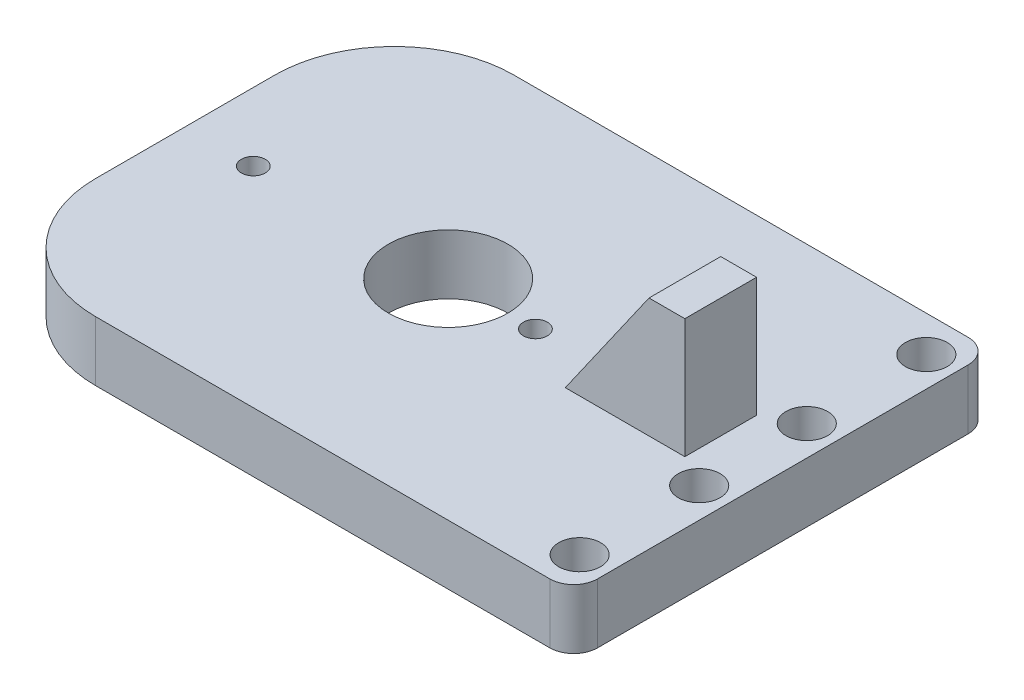
ISO-10303-21;
HEADER;
FILE_DESCRIPTION(('STEP AP214'),'2;1');
FILE_NAME('part.step','',(''),(''),'','','');
FILE_SCHEMA(('AUTOMOTIVE_DESIGN { 1 0 10303 214 1 1 1 1 }'));
ENDSEC;
DATA;
#1=APPLICATION_CONTEXT('core data for automotive mechanical design processes');
#2=APPLICATION_PROTOCOL_DEFINITION('international standard','automotive_design',2000,#1);
#3=PRODUCT_CONTEXT('',#1,'mechanical');
#4=PRODUCT('Part','Part','',(#3));
#5=PRODUCT_RELATED_PRODUCT_CATEGORY('part','',(#4));
#6=PRODUCT_DEFINITION_FORMATION('','',#4);
#7=PRODUCT_DEFINITION_CONTEXT('part definition',#1,'design');
#8=PRODUCT_DEFINITION('design','',#6,#7);
#9=PRODUCT_DEFINITION_SHAPE('','',#8);
#10=(LENGTH_UNIT() NAMED_UNIT(*) SI_UNIT(.MILLI.,.METRE.));
#11=(NAMED_UNIT(*) PLANE_ANGLE_UNIT() SI_UNIT($,.RADIAN.));
#12=(NAMED_UNIT(*) SI_UNIT($,.STERADIAN.) SOLID_ANGLE_UNIT());
#13=UNCERTAINTY_MEASURE_WITH_UNIT(LENGTH_MEASURE(1.E-05),#10,'distance_accuracy_value','');
#14=(GEOMETRIC_REPRESENTATION_CONTEXT(3) GLOBAL_UNCERTAINTY_ASSIGNED_CONTEXT((#13)) GLOBAL_UNIT_ASSIGNED_CONTEXT((#10,
#11,#12)) REPRESENTATION_CONTEXT('',''));
#15=CARTESIAN_POINT('',(0.,0.,0.));
#16=DIRECTION('',(0.,0.,1.));
#17=DIRECTION('',(1.,0.,0.));
#18=AXIS2_PLACEMENT_3D('',#15,#16,#17);
#19=CARTESIAN_POINT('',(0.,5.,0.));
#20=DIRECTION('',(0.,1.,0.));
#21=DIRECTION('',(0.,0.,1.));
#22=AXIS2_PLACEMENT_3D('',#19,#20,#21);
#23=PLANE('',#22);
#24=CARTESIAN_POINT('',(5.70000000000001,5.,-17.5));
#25=DIRECTION('',(0.,1.,0.));
#26=DIRECTION('',(0.,0.,1.));
#27=AXIS2_PLACEMENT_3D('',#24,#25,#26);
#28=CIRCLE('',#27,1.);
#29=CARTESIAN_POINT('',(5.70000000000001,5.,-16.5));
#30=VERTEX_POINT('',#29);
#31=EDGE_CURVE('E332',#30,#30,#28,.T.);
#32=ORIENTED_EDGE('',*,*,#31,.F.);
#33=EDGE_LOOP('',(#32));
#34=FACE_BOUND('',#33,.T.);
#35=CARTESIAN_POINT('',(29.3,5.,-17.5));
#36=DIRECTION('',(0.,1.,0.));
#37=DIRECTION('',(0.,0.,1.));
#38=AXIS2_PLACEMENT_3D('',#35,#36,#37);
#39=CIRCLE('',#38,0.999999999999998);
#40=CARTESIAN_POINT('',(29.3,5.,-16.5));
#41=VERTEX_POINT('',#40);
#42=EDGE_CURVE('E326',#41,#41,#39,.T.);
#43=ORIENTED_EDGE('',*,*,#42,.F.);
#44=EDGE_LOOP('',(#43));
#45=FACE_BOUND('',#44,.T.);
#46=CARTESIAN_POINT('',(47.5,5.,-13.));
#47=DIRECTION('',(0.,1.,0.));
#48=DIRECTION('',(0.,0.,1.));
#49=AXIS2_PLACEMENT_3D('',#46,#47,#48);
#50=CIRCLE('',#49,1.75);
#51=CARTESIAN_POINT('',(47.5,5.,-11.25));
#52=VERTEX_POINT('',#51);
#53=EDGE_CURVE('E229',#52,#52,#50,.T.);
#54=ORIENTED_EDGE('',*,*,#53,.F.);
#55=EDGE_LOOP('',(#54));
#56=FACE_BOUND('',#55,.T.);
#57=CARTESIAN_POINT('',(47.5,5.,-32.));
#58=DIRECTION('',(0.,1.,0.));
#59=DIRECTION('',(0.,0.,1.));
#60=AXIS2_PLACEMENT_3D('',#57,#58,#59);
#61=CIRCLE('',#60,1.75);
#62=CARTESIAN_POINT('',(47.5,5.,-30.25));
#63=VERTEX_POINT('',#62);
#64=EDGE_CURVE('E241',#63,#63,#61,.T.);
#65=ORIENTED_EDGE('',*,*,#64,.F.);
#66=EDGE_LOOP('',(#65));
#67=FACE_BOUND('',#66,.T.);
#68=DIRECTION('',(1.,0.,0.));
#69=VECTOR('',#68,1.);
#70=CARTESIAN_POINT('',(0.,5.,0.));
#71=LINE('',#70,#69);
#72=CARTESIAN_POINT('',(10.,5.,0.));
#73=VERTEX_POINT('',#72);
#74=CARTESIAN_POINT('',(48.,5.,0.));
#75=VERTEX_POINT('',#74);
#76=EDGE_CURVE('E253',#73,#75,#71,.T.);
#77=ORIENTED_EDGE('',*,*,#76,.T.);
#78=CARTESIAN_POINT('',(48.,5.,-2.));
#79=DIRECTION('',(0.,1.,0.));
#80=DIRECTION('',(0.,0.,1.));
#81=AXIS2_PLACEMENT_3D('',#78,#79,#80);
#82=CIRCLE('',#81,2.);
#83=CARTESIAN_POINT('',(50.,5.,-2.));
#84=VERTEX_POINT('',#83);
#85=EDGE_CURVE('E307',#75,#84,#82,.T.);
#86=ORIENTED_EDGE('',*,*,#85,.T.);
#87=DIRECTION('',(0.,0.,-1.));
#88=VECTOR('',#87,1.);
#89=CARTESIAN_POINT('',(50.,5.,0.));
#90=LINE('',#89,#88);
#91=CARTESIAN_POINT('',(50.,5.,-33.));
#92=VERTEX_POINT('',#91);
#93=EDGE_CURVE('E256',#84,#92,#90,.T.);
#94=ORIENTED_EDGE('',*,*,#93,.T.);
#95=CARTESIAN_POINT('',(48.,5.,-33.));
#96=DIRECTION('',(0.,1.,0.));
#97=DIRECTION('',(0.,0.,1.));
#98=AXIS2_PLACEMENT_3D('',#95,#96,#97);
#99=CIRCLE('',#98,2.);
#100=CARTESIAN_POINT('',(48.,5.,-35.));
#101=VERTEX_POINT('',#100);
#102=EDGE_CURVE('E305',#92,#101,#99,.T.);
#103=ORIENTED_EDGE('',*,*,#102,.T.);
#104=DIRECTION('',(1.,0.,0.));
#105=VECTOR('',#104,1.);
#106=CARTESIAN_POINT('',(0.,5.,-35.));
#107=LINE('',#106,#105);
#108=CARTESIAN_POINT('',(10.,5.,-35.));
#109=VERTEX_POINT('',#108);
#110=EDGE_CURVE('E260',#109,#101,#107,.T.);
#111=ORIENTED_EDGE('',*,*,#110,.F.);
#112=CARTESIAN_POINT('',(10.,5.,-25.));
#113=DIRECTION('',(0.,1.,0.));
#114=DIRECTION('',(0.,0.,1.));
#115=AXIS2_PLACEMENT_3D('',#112,#113,#114);
#116=CIRCLE('',#115,10.);
#117=CARTESIAN_POINT('',(0.,5.,-25.));
#118=VERTEX_POINT('',#117);
#119=EDGE_CURVE('E288',#109,#118,#116,.T.);
#120=ORIENTED_EDGE('',*,*,#119,.T.);
#121=DIRECTION('',(0.,0.,-1.));
#122=VECTOR('',#121,1.);
#123=CARTESIAN_POINT('',(0.,5.,0.));
#124=LINE('',#123,#122);
#125=CARTESIAN_POINT('',(0.,5.,-10.));
#126=VERTEX_POINT('',#125);
#127=EDGE_CURVE('E263',#126,#118,#124,.T.);
#128=ORIENTED_EDGE('',*,*,#127,.F.);
#129=CARTESIAN_POINT('',(10.,5.,-10.));
#130=DIRECTION('',(0.,1.,0.));
#131=DIRECTION('',(0.,0.,1.));
#132=AXIS2_PLACEMENT_3D('',#129,#130,#131);
#133=CIRCLE('',#132,10.);
#134=EDGE_CURVE('E290',#126,#73,#133,.T.);
#135=ORIENTED_EDGE('',*,*,#134,.T.);
#136=EDGE_LOOP('',(#77,#86,#94,#103,#111,#120,#128,#135));
#137=FACE_BOUND('',#136,.T.);
#138=CARTESIAN_POINT('',(22.,5.,-17.5));
#139=DIRECTION('',(0.,1.,0.));
#140=DIRECTION('',(0.,0.,1.));
#141=AXIS2_PLACEMENT_3D('',#138,#139,#140);
#142=CIRCLE('',#141,5.);
#143=CARTESIAN_POINT('',(22.,5.,-12.5));
#144=VERTEX_POINT('',#143);
#145=EDGE_CURVE('E247',#144,#144,#142,.T.);
#146=ORIENTED_EDGE('',*,*,#145,.F.);
#147=EDGE_LOOP('',(#146));
#148=FACE_BOUND('',#147,.T.);
#149=CARTESIAN_POINT('',(47.5,5.,-22.));
#150=DIRECTION('',(0.,1.,0.));
#151=DIRECTION('',(0.,0.,1.));
#152=AXIS2_PLACEMENT_3D('',#149,#150,#151);
#153=CIRCLE('',#152,1.75);
#154=CARTESIAN_POINT('',(47.5,5.,-20.25));
#155=VERTEX_POINT('',#154);
#156=EDGE_CURVE('E235',#155,#155,#153,.T.);
#157=ORIENTED_EDGE('',*,*,#156,.F.);
#158=EDGE_LOOP('',(#157));
#159=FACE_BOUND('',#158,.T.);
#160=CARTESIAN_POINT('',(47.5,5.,-3.));
#161=DIRECTION('',(0.,1.,0.));
#162=DIRECTION('',(0.,0.,1.));
#163=AXIS2_PLACEMENT_3D('',#160,#161,#162);
#164=CIRCLE('',#163,1.75);
#165=CARTESIAN_POINT('',(47.5,5.,-1.25));
#166=VERTEX_POINT('',#165);
#167=EDGE_CURVE('E221',#166,#166,#164,.T.);
#168=ORIENTED_EDGE('',*,*,#167,.F.);
#169=EDGE_LOOP('',(#168));
#170=FACE_BOUND('',#169,.T.);
#171=DIRECTION('',(-1.,0.,0.));
#172=VECTOR('',#171,1.);
#173=CARTESIAN_POINT('',(44.8,5.,-20.5));
#174=LINE('',#173,#172);
#175=CARTESIAN_POINT('',(44.8,5.,-20.5));
#176=VERTEX_POINT('',#175);
#177=CARTESIAN_POINT('',(34.8,5.,-20.5));
#178=VERTEX_POINT('',#177);
#179=EDGE_CURVE('E319',#176,#178,#174,.T.);
#180=ORIENTED_EDGE('',*,*,#179,.F.);
#181=DIRECTION('',(0.,0.,-1.));
#182=VECTOR('',#181,1.);
#183=CARTESIAN_POINT('',(44.8,5.,-20.5));
#184=LINE('',#183,#182);
#185=CARTESIAN_POINT('',(44.8,5.,-14.5));
#186=VERTEX_POINT('',#185);
#187=EDGE_CURVE('E215',#186,#176,#184,.T.);
#188=ORIENTED_EDGE('',*,*,#187,.F.);
#189=DIRECTION('',(1.,0.,0.));
#190=VECTOR('',#189,1.);
#191=CARTESIAN_POINT('',(44.8,5.,-14.5));
#192=LINE('',#191,#190);
#193=CARTESIAN_POINT('',(34.8,5.,-14.5));
#194=VERTEX_POINT('',#193);
#195=EDGE_CURVE('E211',#194,#186,#192,.T.);
#196=ORIENTED_EDGE('',*,*,#195,.F.);
#197=DIRECTION('',(0.,0.,1.));
#198=VECTOR('',#197,1.);
#199=CARTESIAN_POINT('',(34.8,5.,-20.5));
#200=LINE('',#199,#198);
#201=EDGE_CURVE('E318',#178,#194,#200,.T.);
#202=ORIENTED_EDGE('',*,*,#201,.F.);
#203=EDGE_LOOP('',(#180,#188,#196,#202));
#204=FACE_BOUND('',#203,.T.);
#205=ADVANCED_FACE('F110',(#34,#45,#56,#67,#137,#148,#159,#170,#204),#23,.T.);
#206=CARTESIAN_POINT('',(0.,0.,0.));
#207=DIRECTION('',(0.,1.,0.));
#208=DIRECTION('',(0.,0.,1.));
#209=AXIS2_PLACEMENT_3D('',#206,#207,#208);
#210=PLANE('',#209);
#211=CARTESIAN_POINT('',(5.70000000000001,0.,-17.5));
#212=DIRECTION('',(0.,1.,0.));
#213=DIRECTION('',(0.,0.,1.));
#214=AXIS2_PLACEMENT_3D('',#211,#212,#213);
#215=CIRCLE('',#214,1.);
#216=CARTESIAN_POINT('',(5.70000000000001,0.,-16.5));
#217=VERTEX_POINT('',#216);
#218=EDGE_CURVE('E324',#217,#217,#215,.T.);
#219=ORIENTED_EDGE('',*,*,#218,.T.);
#220=EDGE_LOOP('',(#219));
#221=FACE_BOUND('',#220,.T.);
#222=CARTESIAN_POINT('',(29.3,0.,-17.5));
#223=DIRECTION('',(0.,1.,0.));
#224=DIRECTION('',(0.,0.,1.));
#225=AXIS2_PLACEMENT_3D('',#222,#223,#224);
#226=CIRCLE('',#225,0.999999999999998);
#227=CARTESIAN_POINT('',(29.3,0.,-16.5));
#228=VERTEX_POINT('',#227);
#229=EDGE_CURVE('E329',#228,#228,#226,.T.);
#230=ORIENTED_EDGE('',*,*,#229,.T.);
#231=EDGE_LOOP('',(#230));
#232=FACE_BOUND('',#231,.T.);
#233=DIRECTION('',(0.,0.,-1.));
#234=VECTOR('',#233,1.);
#235=CARTESIAN_POINT('',(50.,0.,0.));
#236=LINE('',#235,#234);
#237=CARTESIAN_POINT('',(50.,0.,-2.));
#238=VERTEX_POINT('',#237);
#239=CARTESIAN_POINT('',(50.,0.,-33.));
#240=VERTEX_POINT('',#239);
#241=EDGE_CURVE('E269',#238,#240,#236,.T.);
#242=ORIENTED_EDGE('',*,*,#241,.F.);
#243=CARTESIAN_POINT('',(48.,0.,-2.));
#244=DIRECTION('',(0.,1.,0.));
#245=DIRECTION('',(0.,0.,1.));
#246=AXIS2_PLACEMENT_3D('',#243,#244,#245);
#247=CIRCLE('',#246,2.);
#248=CARTESIAN_POINT('',(48.,0.,0.));
#249=VERTEX_POINT('',#248);
#250=EDGE_CURVE('E301',#238,#249,#247,.F.);
#251=ORIENTED_EDGE('',*,*,#250,.T.);
#252=DIRECTION('',(1.,0.,0.));
#253=VECTOR('',#252,1.);
#254=CARTESIAN_POINT('',(0.,0.,0.));
#255=LINE('',#254,#253);
#256=CARTESIAN_POINT('',(10.,0.,0.));
#257=VERTEX_POINT('',#256);
#258=EDGE_CURVE('E250',#257,#249,#255,.T.);
#259=ORIENTED_EDGE('',*,*,#258,.F.);
#260=CARTESIAN_POINT('',(10.,0.,-10.));
#261=DIRECTION('',(0.,1.,0.));
#262=DIRECTION('',(0.,0.,1.));
#263=AXIS2_PLACEMENT_3D('',#260,#261,#262);
#264=CIRCLE('',#263,10.);
#265=CARTESIAN_POINT('',(0.,0.,-10.));
#266=VERTEX_POINT('',#265);
#267=EDGE_CURVE('E281',#257,#266,#264,.F.);
#268=ORIENTED_EDGE('',*,*,#267,.T.);
#269=DIRECTION('',(0.,0.,-1.));
#270=VECTOR('',#269,1.);
#271=CARTESIAN_POINT('',(0.,0.,0.));
#272=LINE('',#271,#270);
#273=CARTESIAN_POINT('',(0.,0.,-25.));
#274=VERTEX_POINT('',#273);
#275=EDGE_CURVE('E257',#266,#274,#272,.T.);
#276=ORIENTED_EDGE('',*,*,#275,.T.);
#277=CARTESIAN_POINT('',(10.,0.,-25.));
#278=DIRECTION('',(0.,1.,0.));
#279=DIRECTION('',(0.,0.,1.));
#280=AXIS2_PLACEMENT_3D('',#277,#278,#279);
#281=CIRCLE('',#280,10.);
#282=CARTESIAN_POINT('',(10.,0.,-35.));
#283=VERTEX_POINT('',#282);
#284=EDGE_CURVE('E279',#274,#283,#281,.F.);
#285=ORIENTED_EDGE('',*,*,#284,.T.);
#286=DIRECTION('',(1.,0.,0.));
#287=VECTOR('',#286,1.);
#288=CARTESIAN_POINT('',(0.,0.,-35.));
#289=LINE('',#288,#287);
#290=CARTESIAN_POINT('',(48.,0.,-35.));
#291=VERTEX_POINT('',#290);
#292=EDGE_CURVE('E272',#283,#291,#289,.T.);
#293=ORIENTED_EDGE('',*,*,#292,.T.);
#294=CARTESIAN_POINT('',(48.,0.,-33.));
#295=DIRECTION('',(0.,1.,0.));
#296=DIRECTION('',(0.,0.,1.));
#297=AXIS2_PLACEMENT_3D('',#294,#295,#296);
#298=CIRCLE('',#297,2.);
#299=EDGE_CURVE('E299',#291,#240,#298,.F.);
#300=ORIENTED_EDGE('',*,*,#299,.T.);
#301=EDGE_LOOP('',(#242,#251,#259,#268,#276,#285,#293,#300));
#302=FACE_BOUND('',#301,.T.);
#303=CARTESIAN_POINT('',(22.,0.,-17.5));
#304=DIRECTION('',(0.,1.,0.));
#305=DIRECTION('',(0.,0.,1.));
#306=AXIS2_PLACEMENT_3D('',#303,#304,#305);
#307=CIRCLE('',#306,5.);
#308=CARTESIAN_POINT('',(22.,0.,-12.5));
#309=VERTEX_POINT('',#308);
#310=EDGE_CURVE('E244',#309,#309,#307,.T.);
#311=ORIENTED_EDGE('',*,*,#310,.T.);
#312=EDGE_LOOP('',(#311));
#313=FACE_BOUND('',#312,.T.);
#314=CARTESIAN_POINT('',(47.5,0.,-32.));
#315=DIRECTION('',(0.,1.,0.));
#316=DIRECTION('',(0.,0.,1.));
#317=AXIS2_PLACEMENT_3D('',#314,#315,#316);
#318=CIRCLE('',#317,1.75);
#319=CARTESIAN_POINT('',(47.5,0.,-30.25));
#320=VERTEX_POINT('',#319);
#321=EDGE_CURVE('E238',#320,#320,#318,.T.);
#322=ORIENTED_EDGE('',*,*,#321,.T.);
#323=EDGE_LOOP('',(#322));
#324=FACE_BOUND('',#323,.T.);
#325=CARTESIAN_POINT('',(47.5,0.,-22.));
#326=DIRECTION('',(0.,1.,0.));
#327=DIRECTION('',(0.,0.,1.));
#328=AXIS2_PLACEMENT_3D('',#325,#326,#327);
#329=CIRCLE('',#328,1.75);
#330=CARTESIAN_POINT('',(47.5,0.,-20.25));
#331=VERTEX_POINT('',#330);
#332=EDGE_CURVE('E232',#331,#331,#329,.T.);
#333=ORIENTED_EDGE('',*,*,#332,.T.);
#334=EDGE_LOOP('',(#333));
#335=FACE_BOUND('',#334,.T.);
#336=CARTESIAN_POINT('',(47.5,0.,-13.));
#337=DIRECTION('',(0.,1.,0.));
#338=DIRECTION('',(0.,0.,1.));
#339=AXIS2_PLACEMENT_3D('',#336,#337,#338);
#340=CIRCLE('',#339,1.75);
#341=CARTESIAN_POINT('',(47.5,0.,-11.25));
#342=VERTEX_POINT('',#341);
#343=EDGE_CURVE('E227',#342,#342,#340,.T.);
#344=ORIENTED_EDGE('',*,*,#343,.T.);
#345=EDGE_LOOP('',(#344));
#346=FACE_BOUND('',#345,.T.);
#347=CARTESIAN_POINT('',(47.5,0.,-3.));
#348=DIRECTION('',(0.,1.,0.));
#349=DIRECTION('',(0.,0.,1.));
#350=AXIS2_PLACEMENT_3D('',#347,#348,#349);
#351=CIRCLE('',#350,1.75);
#352=CARTESIAN_POINT('',(47.5,0.,-1.25));
#353=VERTEX_POINT('',#352);
#354=EDGE_CURVE('E217',#353,#353,#351,.T.);
#355=ORIENTED_EDGE('',*,*,#354,.T.);
#356=EDGE_LOOP('',(#355));
#357=FACE_BOUND('',#356,.T.);
#358=ADVANCED_FACE('F338',(#221,#232,#302,#313,#324,#335,#346,#357),#210,.F.);
#359=CARTESIAN_POINT('',(0.,5.,0.));
#360=DIRECTION('',(0.,0.,-1.));
#361=DIRECTION('',(-1.,0.,0.));
#362=AXIS2_PLACEMENT_3D('',#359,#360,#361);
#363=PLANE('',#362);
#364=ORIENTED_EDGE('',*,*,#258,.T.);
#365=DIRECTION('',(0.,-1.,0.));
#366=VECTOR('',#365,1.);
#367=CARTESIAN_POINT('',(48.,5.,0.));
#368=LINE('',#367,#366);
#369=EDGE_CURVE('E303',#249,#75,#368,.F.);
#370=ORIENTED_EDGE('',*,*,#369,.T.);
#371=ORIENTED_EDGE('',*,*,#76,.F.);
#372=DIRECTION('',(0.,-1.,0.));
#373=VECTOR('',#372,1.);
#374=CARTESIAN_POINT('',(10.,0.,0.));
#375=LINE('',#374,#373);
#376=EDGE_CURVE('E266',#73,#257,#375,.T.);
#377=ORIENTED_EDGE('',*,*,#376,.T.);
#378=EDGE_LOOP('',(#364,#370,#371,#377));
#379=FACE_BOUND('',#378,.T.);
#380=ADVANCED_FACE('F375',(#379),#363,.F.);
#381=CARTESIAN_POINT('',(50.,5.,0.));
#382=DIRECTION('',(-1.,0.,0.));
#383=DIRECTION('',(0.,0.,1.));
#384=AXIS2_PLACEMENT_3D('',#381,#382,#383);
#385=PLANE('',#384);
#386=ORIENTED_EDGE('',*,*,#93,.F.);
#387=DIRECTION('',(0.,-1.,0.));
#388=VECTOR('',#387,1.);
#389=CARTESIAN_POINT('',(50.,5.,-2.));
#390=LINE('',#389,#388);
#391=EDGE_CURVE('E296',#84,#238,#390,.T.);
#392=ORIENTED_EDGE('',*,*,#391,.T.);
#393=ORIENTED_EDGE('',*,*,#241,.T.);
#394=DIRECTION('',(0.,-1.,0.));
#395=VECTOR('',#394,1.);
#396=CARTESIAN_POINT('',(50.,5.,-33.));
#397=LINE('',#396,#395);
#398=EDGE_CURVE('E294',#240,#92,#397,.F.);
#399=ORIENTED_EDGE('',*,*,#398,.T.);
#400=EDGE_LOOP('',(#386,#392,#393,#399));
#401=FACE_BOUND('',#400,.T.);
#402=ADVANCED_FACE('F381',(#401),#385,.F.);
#403=CARTESIAN_POINT('',(0.,5.,-35.));
#404=DIRECTION('',(0.,0.,-1.));
#405=DIRECTION('',(-1.,0.,0.));
#406=AXIS2_PLACEMENT_3D('',#403,#404,#405);
#407=PLANE('',#406);
#408=ORIENTED_EDGE('',*,*,#110,.T.);
#409=DIRECTION('',(0.,-1.,0.));
#410=VECTOR('',#409,1.);
#411=CARTESIAN_POINT('',(48.,0.,-35.));
#412=LINE('',#411,#410);
#413=EDGE_CURVE('E309',#101,#291,#412,.T.);
#414=ORIENTED_EDGE('',*,*,#413,.T.);
#415=ORIENTED_EDGE('',*,*,#292,.F.);
#416=DIRECTION('',(0.,-1.,0.));
#417=VECTOR('',#416,1.);
#418=CARTESIAN_POINT('',(10.,5.,-35.));
#419=LINE('',#418,#417);
#420=EDGE_CURVE('E292',#283,#109,#419,.F.);
#421=ORIENTED_EDGE('',*,*,#420,.T.);
#422=EDGE_LOOP('',(#408,#414,#415,#421));
#423=FACE_BOUND('',#422,.T.);
#424=ADVANCED_FACE('F390',(#423),#407,.T.);
#425=CARTESIAN_POINT('',(0.,5.,0.));
#426=DIRECTION('',(-1.,0.,0.));
#427=DIRECTION('',(0.,0.,1.));
#428=AXIS2_PLACEMENT_3D('',#425,#426,#427);
#429=PLANE('',#428);
#430=ORIENTED_EDGE('',*,*,#275,.F.);
#431=DIRECTION('',(0.,-1.,0.));
#432=VECTOR('',#431,1.);
#433=CARTESIAN_POINT('',(0.,5.,-10.));
#434=LINE('',#433,#432);
#435=EDGE_CURVE('E286',#266,#126,#434,.F.);
#436=ORIENTED_EDGE('',*,*,#435,.T.);
#437=ORIENTED_EDGE('',*,*,#127,.T.);
#438=DIRECTION('',(0.,-1.,0.));
#439=VECTOR('',#438,1.);
#440=CARTESIAN_POINT('',(0.,5.,-25.));
#441=LINE('',#440,#439);
#442=EDGE_CURVE('E283',#118,#274,#441,.T.);
#443=ORIENTED_EDGE('',*,*,#442,.T.);
#444=EDGE_LOOP('',(#430,#436,#437,#443));
#445=FACE_BOUND('',#444,.T.);
#446=ADVANCED_FACE('F386',(#445),#429,.T.);
#447=CARTESIAN_POINT('',(22.,5.,-17.5));
#448=DIRECTION('',(0.,-1.,0.));
#449=DIRECTION('',(0.,0.,-1.));
#450=AXIS2_PLACEMENT_3D('',#447,#448,#449);
#451=CYLINDRICAL_SURFACE('',#450,5.);
#452=ORIENTED_EDGE('',*,*,#145,.T.);
#453=EDGE_LOOP('',(#452));
#454=FACE_BOUND('',#453,.T.);
#455=ORIENTED_EDGE('',*,*,#310,.F.);
#456=EDGE_LOOP('',(#455));
#457=FACE_BOUND('',#456,.T.);
#458=ADVANCED_FACE('F389',(#454,#457),#451,.F.);
#459=CARTESIAN_POINT('',(47.5,5.,-32.));
#460=DIRECTION('',(0.,-1.,0.));
#461=DIRECTION('',(0.,0.,-1.));
#462=AXIS2_PLACEMENT_3D('',#459,#460,#461);
#463=CYLINDRICAL_SURFACE('',#462,1.75);
#464=ORIENTED_EDGE('',*,*,#64,.T.);
#465=EDGE_LOOP('',(#464));
#466=FACE_BOUND('',#465,.T.);
#467=ORIENTED_EDGE('',*,*,#321,.F.);
#468=EDGE_LOOP('',(#467));
#469=FACE_BOUND('',#468,.T.);
#470=ADVANCED_FACE('F450',(#466,#469),#463,.F.);
#471=CARTESIAN_POINT('',(47.5,5.,-22.));
#472=DIRECTION('',(0.,-1.,0.));
#473=DIRECTION('',(0.,0.,-1.));
#474=AXIS2_PLACEMENT_3D('',#471,#472,#473);
#475=CYLINDRICAL_SURFACE('',#474,1.75);
#476=ORIENTED_EDGE('',*,*,#156,.T.);
#477=EDGE_LOOP('',(#476));
#478=FACE_BOUND('',#477,.T.);
#479=ORIENTED_EDGE('',*,*,#332,.F.);
#480=EDGE_LOOP('',(#479));
#481=FACE_BOUND('',#480,.T.);
#482=ADVANCED_FACE('F444',(#478,#481),#475,.F.);
#483=CARTESIAN_POINT('',(47.5,5.,-13.));
#484=DIRECTION('',(0.,-1.,0.));
#485=DIRECTION('',(0.,0.,-1.));
#486=AXIS2_PLACEMENT_3D('',#483,#484,#485);
#487=CYLINDRICAL_SURFACE('',#486,1.75);
#488=ORIENTED_EDGE('',*,*,#53,.T.);
#489=EDGE_LOOP('',(#488));
#490=FACE_BOUND('',#489,.T.);
#491=ORIENTED_EDGE('',*,*,#343,.F.);
#492=EDGE_LOOP('',(#491));
#493=FACE_BOUND('',#492,.T.);
#494=ADVANCED_FACE('F370',(#490,#493),#487,.F.);
#495=CARTESIAN_POINT('',(47.5,5.,-3.));
#496=DIRECTION('',(0.,-1.,0.));
#497=DIRECTION('',(0.,0.,-1.));
#498=AXIS2_PLACEMENT_3D('',#495,#496,#497);
#499=CYLINDRICAL_SURFACE('',#498,1.75);
#500=ORIENTED_EDGE('',*,*,#167,.T.);
#501=EDGE_LOOP('',(#500));
#502=FACE_BOUND('',#501,.T.);
#503=ORIENTED_EDGE('',*,*,#354,.F.);
#504=EDGE_LOOP('',(#503));
#505=FACE_BOUND('',#504,.T.);
#506=ADVANCED_FACE('F366',(#502,#505),#499,.F.);
#507=CARTESIAN_POINT('',(10.,5.,-10.));
#508=DIRECTION('',(0.,1.,0.));
#509=DIRECTION('',(0.,0.,1.));
#510=AXIS2_PLACEMENT_3D('',#507,#508,#509);
#511=CYLINDRICAL_SURFACE('',#510,10.);
#512=ORIENTED_EDGE('',*,*,#134,.F.);
#513=ORIENTED_EDGE('',*,*,#435,.F.);
#514=ORIENTED_EDGE('',*,*,#267,.F.);
#515=ORIENTED_EDGE('',*,*,#376,.F.);
#516=EDGE_LOOP('',(#512,#513,#514,#515));
#517=FACE_BOUND('',#516,.T.);
#518=ADVANCED_FACE('F369',(#517),#511,.T.);
#519=CARTESIAN_POINT('',(10.,5.,-25.));
#520=DIRECTION('',(0.,-1.,0.));
#521=DIRECTION('',(0.,0.,-1.));
#522=AXIS2_PLACEMENT_3D('',#519,#520,#521);
#523=CYLINDRICAL_SURFACE('',#522,10.);
#524=ORIENTED_EDGE('',*,*,#119,.F.);
#525=ORIENTED_EDGE('',*,*,#420,.F.);
#526=ORIENTED_EDGE('',*,*,#284,.F.);
#527=ORIENTED_EDGE('',*,*,#442,.F.);
#528=EDGE_LOOP('',(#524,#525,#526,#527));
#529=FACE_BOUND('',#528,.T.);
#530=ADVANCED_FACE('F400',(#529),#523,.T.);
#531=CARTESIAN_POINT('',(48.,5.,-2.));
#532=DIRECTION('',(0.,-1.,0.));
#533=DIRECTION('',(0.,0.,-1.));
#534=AXIS2_PLACEMENT_3D('',#531,#532,#533);
#535=CYLINDRICAL_SURFACE('',#534,2.);
#536=ORIENTED_EDGE('',*,*,#85,.F.);
#537=ORIENTED_EDGE('',*,*,#369,.F.);
#538=ORIENTED_EDGE('',*,*,#250,.F.);
#539=ORIENTED_EDGE('',*,*,#391,.F.);
#540=EDGE_LOOP('',(#536,#537,#538,#539));
#541=FACE_BOUND('',#540,.T.);
#542=ADVANCED_FACE('F404',(#541),#535,.T.);
#543=CARTESIAN_POINT('',(48.,5.,-33.));
#544=DIRECTION('',(0.,1.,0.));
#545=DIRECTION('',(0.,0.,1.));
#546=AXIS2_PLACEMENT_3D('',#543,#544,#545);
#547=CYLINDRICAL_SURFACE('',#546,2.);
#548=ORIENTED_EDGE('',*,*,#102,.F.);
#549=ORIENTED_EDGE('',*,*,#398,.F.);
#550=ORIENTED_EDGE('',*,*,#299,.F.);
#551=ORIENTED_EDGE('',*,*,#413,.F.);
#552=EDGE_LOOP('',(#548,#549,#550,#551));
#553=FACE_BOUND('',#552,.T.);
#554=ADVANCED_FACE('F407',(#553),#547,.T.);
#555=CARTESIAN_POINT('',(44.8,15.,-20.5));
#556=DIRECTION('',(-1.,0.,0.));
#557=DIRECTION('',(0.,0.,1.));
#558=AXIS2_PLACEMENT_3D('',#555,#556,#557);
#559=PLANE('',#558);
#560=ORIENTED_EDGE('',*,*,#187,.T.);
#561=DIRECTION('',(0.,-1.,0.));
#562=VECTOR('',#561,1.);
#563=CARTESIAN_POINT('',(44.8,15.,-20.5));
#564=LINE('',#563,#562);
#565=CARTESIAN_POINT('',(44.8,15.,-20.5));
#566=VERTEX_POINT('',#565);
#567=EDGE_CURVE('E199',#566,#176,#564,.T.);
#568=ORIENTED_EDGE('',*,*,#567,.F.);
#569=DIRECTION('',(0.,0.,-1.));
#570=VECTOR('',#569,1.);
#571=CARTESIAN_POINT('',(44.8,15.,-20.5));
#572=LINE('',#571,#570);
#573=CARTESIAN_POINT('',(44.8,15.,-14.5));
#574=VERTEX_POINT('',#573);
#575=EDGE_CURVE('E203',#574,#566,#572,.T.);
#576=ORIENTED_EDGE('',*,*,#575,.F.);
#577=DIRECTION('',(0.,-1.,0.));
#578=VECTOR('',#577,1.);
#579=CARTESIAN_POINT('',(44.8,15.,-14.5));
#580=LINE('',#579,#578);
#581=EDGE_CURVE('E218',#574,#186,#580,.T.);
#582=ORIENTED_EDGE('',*,*,#581,.T.);
#583=EDGE_LOOP('',(#560,#568,#576,#582));
#584=FACE_BOUND('',#583,.T.);
#585=ADVANCED_FACE('F213',(#584),#559,.F.);
#586=CARTESIAN_POINT('',(44.8,15.,-20.5));
#587=DIRECTION('',(0.,0.,1.));
#588=DIRECTION('',(1.,0.,0.));
#589=AXIS2_PLACEMENT_3D('',#586,#587,#588);
#590=PLANE('',#589);
#591=ORIENTED_EDGE('',*,*,#179,.T.);
#592=DIRECTION('',(-0.573576436351044,-0.819152044288993,0.));
#593=VECTOR('',#592,1.);
#594=CARTESIAN_POINT('',(41.8020753820971,15.,-20.5));
#595=LINE('',#594,#593);
#596=CARTESIAN_POINT('',(41.8020753820971,15.,-20.5));
#597=VERTEX_POINT('',#596);
#598=EDGE_CURVE('E12',#178,#597,#595,.F.);
#599=ORIENTED_EDGE('',*,*,#598,.T.);
#600=DIRECTION('',(-1.,0.,0.));
#601=VECTOR('',#600,1.);
#602=CARTESIAN_POINT('',(44.8,15.,-20.5));
#603=LINE('',#602,#601);
#604=EDGE_CURVE('E195',#566,#597,#603,.T.);
#605=ORIENTED_EDGE('',*,*,#604,.F.);
#606=ORIENTED_EDGE('',*,*,#567,.T.);
#607=EDGE_LOOP('',(#591,#599,#605,#606));
#608=FACE_BOUND('',#607,.T.);
#609=ADVANCED_FACE('F197',(#608),#590,.F.);
#610=CARTESIAN_POINT('',(44.8,15.,-14.5));
#611=DIRECTION('',(0.,0.,-1.));
#612=DIRECTION('',(-1.,0.,0.));
#613=AXIS2_PLACEMENT_3D('',#610,#611,#612);
#614=PLANE('',#613);
#615=DIRECTION('',(1.,0.,0.));
#616=VECTOR('',#615,1.);
#617=CARTESIAN_POINT('',(44.8,15.,-14.5));
#618=LINE('',#617,#616);
#619=CARTESIAN_POINT('',(41.8020753820971,15.,-14.5));
#620=VERTEX_POINT('',#619);
#621=EDGE_CURVE('E202',#620,#574,#618,.T.);
#622=ORIENTED_EDGE('',*,*,#621,.F.);
#623=DIRECTION('',(0.573576436351044,0.819152044288993,0.));
#624=VECTOR('',#623,1.);
#625=CARTESIAN_POINT('',(41.8020753820971,15.,-14.5));
#626=LINE('',#625,#624);
#627=EDGE_CURVE('E119',#620,#194,#626,.F.);
#628=ORIENTED_EDGE('',*,*,#627,.T.);
#629=ORIENTED_EDGE('',*,*,#195,.T.);
#630=ORIENTED_EDGE('',*,*,#581,.F.);
#631=EDGE_LOOP('',(#622,#628,#629,#630));
#632=FACE_BOUND('',#631,.T.);
#633=ADVANCED_FACE('F315',(#632),#614,.F.);
#634=CARTESIAN_POINT('',(0.,15.,0.));
#635=DIRECTION('',(0.,-1.,0.));
#636=DIRECTION('',(0.,0.,-1.));
#637=AXIS2_PLACEMENT_3D('',#634,#635,#636);
#638=PLANE('',#637);
#639=ORIENTED_EDGE('',*,*,#604,.T.);
#640=DIRECTION('',(0.,0.,1.));
#641=VECTOR('',#640,1.);
#642=CARTESIAN_POINT('',(41.8020753820971,15.,0.));
#643=LINE('',#642,#641);
#644=EDGE_CURVE('E312',#597,#620,#643,.T.);
#645=ORIENTED_EDGE('',*,*,#644,.T.);
#646=ORIENTED_EDGE('',*,*,#621,.T.);
#647=ORIENTED_EDGE('',*,*,#575,.T.);
#648=EDGE_LOOP('',(#639,#645,#646,#647));
#649=FACE_BOUND('',#648,.T.);
#650=ADVANCED_FACE('F206',(#649),#638,.F.);
#651=CARTESIAN_POINT('',(41.8020753820971,15.,0.));
#652=DIRECTION('',(0.819152044288993,-0.573576436351044,0.));
#653=DIRECTION('',(0.,0.,1.));
#654=AXIS2_PLACEMENT_3D('',#651,#652,#653);
#655=PLANE('',#654);
#656=ORIENTED_EDGE('',*,*,#598,.F.);
#657=ORIENTED_EDGE('',*,*,#201,.T.);
#658=ORIENTED_EDGE('',*,*,#627,.F.);
#659=ORIENTED_EDGE('',*,*,#644,.F.);
#660=EDGE_LOOP('',(#656,#657,#658,#659));
#661=FACE_BOUND('',#660,.T.);
#662=ADVANCED_FACE('F113',(#661),#655,.F.);
#663=CARTESIAN_POINT('',(29.3,0.,-17.5));
#664=DIRECTION('',(0.,1.,0.));
#665=DIRECTION('',(0.,0.,1.));
#666=AXIS2_PLACEMENT_3D('',#663,#664,#665);
#667=CYLINDRICAL_SURFACE('',#666,0.999999999999998);
#668=ORIENTED_EDGE('',*,*,#229,.F.);
#669=EDGE_LOOP('',(#668));
#670=FACE_BOUND('',#669,.T.);
#671=ORIENTED_EDGE('',*,*,#42,.T.);
#672=EDGE_LOOP('',(#671));
#673=FACE_BOUND('',#672,.T.);
#674=ADVANCED_FACE('F344',(#670,#673),#667,.F.);
#675=CARTESIAN_POINT('',(5.70000000000001,0.,-17.5));
#676=DIRECTION('',(0.,1.,0.));
#677=DIRECTION('',(0.,0.,1.));
#678=AXIS2_PLACEMENT_3D('',#675,#676,#677);
#679=CYLINDRICAL_SURFACE('',#678,1.);
#680=ORIENTED_EDGE('',*,*,#218,.F.);
#681=EDGE_LOOP('',(#680));
#682=FACE_BOUND('',#681,.T.);
#683=ORIENTED_EDGE('',*,*,#31,.T.);
#684=EDGE_LOOP('',(#683));
#685=FACE_BOUND('',#684,.T.);
#686=ADVANCED_FACE('F341',(#682,#685),#679,.F.);
#687=CLOSED_SHELL('',(#205,#358,#380,#402,#424,#446,#458,#470,#482,#494,#506,#518,#530,#542,
#554,#585,#609,#633,#650,#662,#674,#686));
#688=MANIFOLD_SOLID_BREP('B2',#687);
#689=ADVANCED_BREP_SHAPE_REPRESENTATION('',(#18,#688),#14);
#690=SHAPE_DEFINITION_REPRESENTATION(#9,#689);
ENDSEC;
END-ISO-10303-21;
